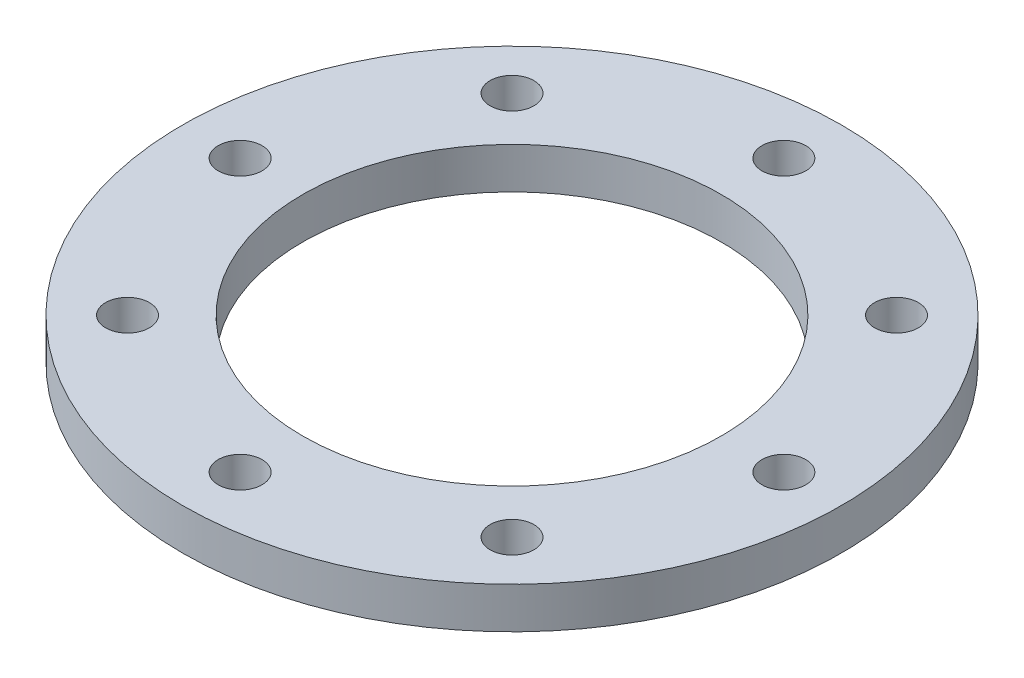
ISO-10303-21;
HEADER;
FILE_DESCRIPTION(('STEP AP214'),'2;1');
FILE_NAME('part.step','',(''),(''),'','','');
FILE_SCHEMA(('AUTOMOTIVE_DESIGN { 1 0 10303 214 1 1 1 1 }'));
ENDSEC;
DATA;
#1=APPLICATION_CONTEXT('core data for automotive mechanical design processes');
#2=APPLICATION_PROTOCOL_DEFINITION('international standard','automotive_design',2000,#1);
#3=PRODUCT_CONTEXT('',#1,'mechanical');
#4=PRODUCT('Part','Part','',(#3));
#5=PRODUCT_RELATED_PRODUCT_CATEGORY('part','',(#4));
#6=PRODUCT_DEFINITION_FORMATION('','',#4);
#7=PRODUCT_DEFINITION_CONTEXT('part definition',#1,'design');
#8=PRODUCT_DEFINITION('design','',#6,#7);
#9=PRODUCT_DEFINITION_SHAPE('','',#8);
#10=(LENGTH_UNIT() NAMED_UNIT(*) SI_UNIT(.MILLI.,.METRE.));
#11=(NAMED_UNIT(*) PLANE_ANGLE_UNIT() SI_UNIT($,.RADIAN.));
#12=(NAMED_UNIT(*) SI_UNIT($,.STERADIAN.) SOLID_ANGLE_UNIT());
#13=UNCERTAINTY_MEASURE_WITH_UNIT(LENGTH_MEASURE(1.E-05),#10,'distance_accuracy_value','');
#14=(GEOMETRIC_REPRESENTATION_CONTEXT(3) GLOBAL_UNCERTAINTY_ASSIGNED_CONTEXT((#13)) GLOBAL_UNIT_ASSIGNED_CONTEXT((#10,
#11,#12)) REPRESENTATION_CONTEXT('',''));
#15=CARTESIAN_POINT('',(0.,0.,0.));
#16=DIRECTION('',(0.,0.,1.));
#17=DIRECTION('',(1.,0.,0.));
#18=AXIS2_PLACEMENT_3D('',#15,#16,#17);
#19=CARTESIAN_POINT('',(0.,6.35,0.));
#20=DIRECTION('',(0.,1.,0.));
#21=DIRECTION('',(0.,0.,1.));
#22=AXIS2_PLACEMENT_3D('',#19,#20,#21);
#23=PLANE('',#22);
#24=CARTESIAN_POINT('',(-29.6348451995278,6.35,-29.6348451995286));
#25=DIRECTION('',(0.,1.,0.));
#26=DIRECTION('',(0.,0.,1.));
#27=AXIS2_PLACEMENT_3D('',#24,#25,#26);
#28=CIRCLE('',#27,3.37819999999999);
#29=CARTESIAN_POINT('',(-29.6348451995278,6.35,-26.2566451995286));
#30=VERTEX_POINT('',#29);
#31=EDGE_CURVE('E94',#30,#30,#28,.T.);
#32=ORIENTED_EDGE('',*,*,#31,.F.);
#33=EDGE_LOOP('',(#32));
#34=FACE_BOUND('',#33,.T.);
#35=CARTESIAN_POINT('',(-41.91,6.35,-4.38983948732747E-13));
#36=DIRECTION('',(0.,1.,0.));
#37=DIRECTION('',(0.,0.,1.));
#38=AXIS2_PLACEMENT_3D('',#35,#36,#37);
#39=CIRCLE('',#38,3.37819999999999);
#40=CARTESIAN_POINT('',(-41.91,6.35,3.37819999999955));
#41=VERTEX_POINT('',#40);
#42=EDGE_CURVE('E88',#41,#41,#39,.T.);
#43=ORIENTED_EDGE('',*,*,#42,.F.);
#44=EDGE_LOOP('',(#43));
#45=FACE_BOUND('',#44,.T.);
#46=CARTESIAN_POINT('',(-29.6348451995285,6.35,29.6348451995279));
#47=DIRECTION('',(0.,1.,0.));
#48=DIRECTION('',(0.,0.,1.));
#49=AXIS2_PLACEMENT_3D('',#46,#47,#48);
#50=CIRCLE('',#49,3.37819999999999);
#51=CARTESIAN_POINT('',(-29.6348451995285,6.35,33.0130451995279));
#52=VERTEX_POINT('',#51);
#53=EDGE_CURVE('E82',#52,#52,#50,.T.);
#54=ORIENTED_EDGE('',*,*,#53,.F.);
#55=EDGE_LOOP('',(#54));
#56=FACE_BOUND('',#55,.T.);
#57=CARTESIAN_POINT('',(0.,6.35,41.91));
#58=DIRECTION('',(0.,1.,0.));
#59=DIRECTION('',(0.,0.,1.));
#60=AXIS2_PLACEMENT_3D('',#57,#58,#59);
#61=CIRCLE('',#60,3.37819999999999);
#62=CARTESIAN_POINT('',(0.,6.35,45.2882));
#63=VERTEX_POINT('',#62);
#64=EDGE_CURVE('E76',#63,#63,#61,.T.);
#65=ORIENTED_EDGE('',*,*,#64,.F.);
#66=EDGE_LOOP('',(#65));
#67=FACE_BOUND('',#66,.T.);
#68=CARTESIAN_POINT('',(29.634845199528,6.35,29.6348451995284));
#69=DIRECTION('',(0.,1.,0.));
#70=DIRECTION('',(0.,0.,1.));
#71=AXIS2_PLACEMENT_3D('',#68,#69,#70);
#72=CIRCLE('',#71,3.37819999999999);
#73=CARTESIAN_POINT('',(29.634845199528,6.35,33.0130451995283));
#74=VERTEX_POINT('',#73);
#75=EDGE_CURVE('E70',#74,#74,#72,.T.);
#76=ORIENTED_EDGE('',*,*,#75,.F.);
#77=EDGE_LOOP('',(#76));
#78=FACE_BOUND('',#77,.T.);
#79=CARTESIAN_POINT('',(41.91,6.35,1.46327982910916E-13));
#80=DIRECTION('',(0.,1.,0.));
#81=DIRECTION('',(0.,0.,1.));
#82=AXIS2_PLACEMENT_3D('',#79,#80,#81);
#83=CIRCLE('',#82,3.37819999999999);
#84=CARTESIAN_POINT('',(41.91,6.35,3.37820000000014));
#85=VERTEX_POINT('',#84);
#86=EDGE_CURVE('E64',#85,#85,#83,.T.);
#87=ORIENTED_EDGE('',*,*,#86,.F.);
#88=EDGE_LOOP('',(#87));
#89=FACE_BOUND('',#88,.T.);
#90=CARTESIAN_POINT('',(29.6348451995283,6.35,-29.6348451995282));
#91=DIRECTION('',(0.,1.,0.));
#92=DIRECTION('',(0.,0.,1.));
#93=AXIS2_PLACEMENT_3D('',#90,#91,#92);
#94=CIRCLE('',#93,3.37819999999999);
#95=CARTESIAN_POINT('',(29.6348451995283,6.35,-26.2566451995282));
#96=VERTEX_POINT('',#95);
#97=EDGE_CURVE('E58',#96,#96,#94,.T.);
#98=ORIENTED_EDGE('',*,*,#97,.F.);
#99=EDGE_LOOP('',(#98));
#100=FACE_BOUND('',#99,.T.);
#101=CARTESIAN_POINT('',(0.,6.35,-41.91));
#102=DIRECTION('',(0.,1.,0.));
#103=DIRECTION('',(0.,0.,1.));
#104=AXIS2_PLACEMENT_3D('',#101,#102,#103);
#105=CIRCLE('',#104,3.37819999999999);
#106=CARTESIAN_POINT('',(0.,6.35,-38.5318));
#107=VERTEX_POINT('',#106);
#108=EDGE_CURVE('E52',#107,#107,#105,.T.);
#109=ORIENTED_EDGE('',*,*,#108,.F.);
#110=EDGE_LOOP('',(#109));
#111=FACE_BOUND('',#110,.T.);
#112=CARTESIAN_POINT('',(0.,6.35,0.));
#113=DIRECTION('',(0.,1.,0.));
#114=DIRECTION('',(0.,0.,1.));
#115=AXIS2_PLACEMENT_3D('',#112,#113,#114);
#116=CIRCLE('',#115,50.8);
#117=CARTESIAN_POINT('',(0.,6.35,50.8));
#118=VERTEX_POINT('',#117);
#119=EDGE_CURVE('E10',#118,#118,#116,.T.);
#120=ORIENTED_EDGE('',*,*,#119,.T.);
#121=EDGE_LOOP('',(#120));
#122=FACE_BOUND('',#121,.T.);
#123=CARTESIAN_POINT('',(0.,6.35,0.));
#124=DIRECTION('',(0.,1.,0.));
#125=DIRECTION('',(0.,0.,1.));
#126=AXIS2_PLACEMENT_3D('',#123,#124,#125);
#127=CIRCLE('',#126,32.258);
#128=CARTESIAN_POINT('',(0.,6.35,32.258));
#129=VERTEX_POINT('',#128);
#130=EDGE_CURVE('E42',#129,#129,#127,.T.);
#131=ORIENTED_EDGE('',*,*,#130,.F.);
#132=EDGE_LOOP('',(#131));
#133=FACE_BOUND('',#132,.T.);
#134=ADVANCED_FACE('F31',(#34,#45,#56,#67,#78,#89,#100,#111,#122,#133),#23,.T.);
#135=CARTESIAN_POINT('',(0.,0.,0.));
#136=DIRECTION('',(0.,1.,0.));
#137=DIRECTION('',(0.,0.,1.));
#138=AXIS2_PLACEMENT_3D('',#135,#136,#137);
#139=PLANE('',#138);
#140=CARTESIAN_POINT('',(-29.6348451995278,0.,-29.6348451995286));
#141=DIRECTION('',(0.,1.,0.));
#142=DIRECTION('',(0.,0.,1.));
#143=AXIS2_PLACEMENT_3D('',#140,#141,#142);
#144=CIRCLE('',#143,3.3782);
#145=CARTESIAN_POINT('',(-29.6348451995278,0.,-26.2566451995286));
#146=VERTEX_POINT('',#145);
#147=EDGE_CURVE('E91',#146,#146,#144,.T.);
#148=ORIENTED_EDGE('',*,*,#147,.T.);
#149=EDGE_LOOP('',(#148));
#150=FACE_BOUND('',#149,.T.);
#151=CARTESIAN_POINT('',(-41.91,0.,-4.38983948732747E-13));
#152=DIRECTION('',(0.,1.,0.));
#153=DIRECTION('',(0.,0.,1.));
#154=AXIS2_PLACEMENT_3D('',#151,#152,#153);
#155=CIRCLE('',#154,3.3782);
#156=CARTESIAN_POINT('',(-41.91,0.,3.37819999999956));
#157=VERTEX_POINT('',#156);
#158=EDGE_CURVE('E85',#157,#157,#155,.T.);
#159=ORIENTED_EDGE('',*,*,#158,.T.);
#160=EDGE_LOOP('',(#159));
#161=FACE_BOUND('',#160,.T.);
#162=CARTESIAN_POINT('',(-29.6348451995285,0.,29.6348451995279));
#163=DIRECTION('',(0.,1.,0.));
#164=DIRECTION('',(0.,0.,1.));
#165=AXIS2_PLACEMENT_3D('',#162,#163,#164);
#166=CIRCLE('',#165,3.3782);
#167=CARTESIAN_POINT('',(-29.6348451995285,0.,33.0130451995279));
#168=VERTEX_POINT('',#167);
#169=EDGE_CURVE('E79',#168,#168,#166,.T.);
#170=ORIENTED_EDGE('',*,*,#169,.T.);
#171=EDGE_LOOP('',(#170));
#172=FACE_BOUND('',#171,.T.);
#173=CARTESIAN_POINT('',(0.,0.,41.91));
#174=DIRECTION('',(0.,1.,0.));
#175=DIRECTION('',(0.,0.,1.));
#176=AXIS2_PLACEMENT_3D('',#173,#174,#175);
#177=CIRCLE('',#176,3.3782);
#178=CARTESIAN_POINT('',(0.,0.,45.2882));
#179=VERTEX_POINT('',#178);
#180=EDGE_CURVE('E73',#179,#179,#177,.T.);
#181=ORIENTED_EDGE('',*,*,#180,.T.);
#182=EDGE_LOOP('',(#181));
#183=FACE_BOUND('',#182,.T.);
#184=CARTESIAN_POINT('',(29.634845199528,0.,29.6348451995284));
#185=DIRECTION('',(0.,1.,0.));
#186=DIRECTION('',(0.,0.,1.));
#187=AXIS2_PLACEMENT_3D('',#184,#185,#186);
#188=CIRCLE('',#187,3.3782);
#189=CARTESIAN_POINT('',(29.634845199528,0.,33.0130451995284));
#190=VERTEX_POINT('',#189);
#191=EDGE_CURVE('E67',#190,#190,#188,.T.);
#192=ORIENTED_EDGE('',*,*,#191,.T.);
#193=EDGE_LOOP('',(#192));
#194=FACE_BOUND('',#193,.T.);
#195=CARTESIAN_POINT('',(41.91,0.,1.46327982910916E-13));
#196=DIRECTION('',(0.,1.,0.));
#197=DIRECTION('',(0.,0.,1.));
#198=AXIS2_PLACEMENT_3D('',#195,#196,#197);
#199=CIRCLE('',#198,3.3782);
#200=CARTESIAN_POINT('',(41.91,0.,3.37820000000014));
#201=VERTEX_POINT('',#200);
#202=EDGE_CURVE('E61',#201,#201,#199,.T.);
#203=ORIENTED_EDGE('',*,*,#202,.T.);
#204=EDGE_LOOP('',(#203));
#205=FACE_BOUND('',#204,.T.);
#206=CARTESIAN_POINT('',(29.6348451995283,0.,-29.6348451995282));
#207=DIRECTION('',(0.,1.,0.));
#208=DIRECTION('',(0.,0.,1.));
#209=AXIS2_PLACEMENT_3D('',#206,#207,#208);
#210=CIRCLE('',#209,3.3782);
#211=CARTESIAN_POINT('',(29.6348451995283,0.,-26.2566451995282));
#212=VERTEX_POINT('',#211);
#213=EDGE_CURVE('E55',#212,#212,#210,.T.);
#214=ORIENTED_EDGE('',*,*,#213,.T.);
#215=EDGE_LOOP('',(#214));
#216=FACE_BOUND('',#215,.T.);
#217=CARTESIAN_POINT('',(0.,0.,-41.91));
#218=DIRECTION('',(0.,1.,0.));
#219=DIRECTION('',(0.,0.,1.));
#220=AXIS2_PLACEMENT_3D('',#217,#218,#219);
#221=CIRCLE('',#220,3.3782);
#222=CARTESIAN_POINT('',(0.,0.,-38.5318));
#223=VERTEX_POINT('',#222);
#224=EDGE_CURVE('E47',#223,#223,#221,.T.);
#225=ORIENTED_EDGE('',*,*,#224,.T.);
#226=EDGE_LOOP('',(#225));
#227=FACE_BOUND('',#226,.T.);
#228=CARTESIAN_POINT('',(0.,0.,0.));
#229=DIRECTION('',(0.,1.,0.));
#230=DIRECTION('',(0.,0.,1.));
#231=AXIS2_PLACEMENT_3D('',#228,#229,#230);
#232=CIRCLE('',#231,50.8);
#233=CARTESIAN_POINT('',(0.,0.,50.8));
#234=VERTEX_POINT('',#233);
#235=EDGE_CURVE('E35',#234,#234,#232,.T.);
#236=ORIENTED_EDGE('',*,*,#235,.F.);
#237=EDGE_LOOP('',(#236));
#238=FACE_BOUND('',#237,.T.);
#239=CARTESIAN_POINT('',(0.,0.,0.));
#240=DIRECTION('',(0.,1.,0.));
#241=DIRECTION('',(0.,0.,1.));
#242=AXIS2_PLACEMENT_3D('',#239,#240,#241);
#243=CIRCLE('',#242,32.258);
#244=CARTESIAN_POINT('',(0.,0.,32.258));
#245=VERTEX_POINT('',#244);
#246=EDGE_CURVE('E44',#245,#245,#243,.T.);
#247=ORIENTED_EDGE('',*,*,#246,.T.);
#248=EDGE_LOOP('',(#247));
#249=FACE_BOUND('',#248,.T.);
#250=ADVANCED_FACE('F102',(#150,#161,#172,#183,#194,#205,#216,#227,#238,#249),#139,.F.);
#251=CARTESIAN_POINT('',(0.,6.35,0.));
#252=DIRECTION('',(0.,-1.,0.));
#253=DIRECTION('',(0.,0.,-1.));
#254=AXIS2_PLACEMENT_3D('',#251,#252,#253);
#255=CYLINDRICAL_SURFACE('',#254,50.8);
#256=ORIENTED_EDGE('',*,*,#119,.F.);
#257=EDGE_LOOP('',(#256));
#258=FACE_BOUND('',#257,.T.);
#259=ORIENTED_EDGE('',*,*,#235,.T.);
#260=EDGE_LOOP('',(#259));
#261=FACE_BOUND('',#260,.T.);
#262=ADVANCED_FACE('F33',(#258,#261),#255,.T.);
#263=CARTESIAN_POINT('',(0.,6.35,0.));
#264=DIRECTION('',(0.,-1.,0.));
#265=DIRECTION('',(0.,0.,-1.));
#266=AXIS2_PLACEMENT_3D('',#263,#264,#265);
#267=CYLINDRICAL_SURFACE('',#266,32.258);
#268=ORIENTED_EDGE('',*,*,#130,.T.);
#269=EDGE_LOOP('',(#268));
#270=FACE_BOUND('',#269,.T.);
#271=ORIENTED_EDGE('',*,*,#246,.F.);
#272=EDGE_LOOP('',(#271));
#273=FACE_BOUND('',#272,.T.);
#274=ADVANCED_FACE('F120',(#270,#273),#267,.F.);
#275=CARTESIAN_POINT('',(0.,6.35,-41.91));
#276=DIRECTION('',(0.,1.,0.));
#277=DIRECTION('',(0.,0.,1.));
#278=AXIS2_PLACEMENT_3D('',#275,#276,#277);
#279=CYLINDRICAL_SURFACE('',#278,3.37819999999999);
#280=ORIENTED_EDGE('',*,*,#224,.F.);
#281=EDGE_LOOP('',(#280));
#282=FACE_BOUND('',#281,.T.);
#283=ORIENTED_EDGE('',*,*,#108,.T.);
#284=EDGE_LOOP('',(#283));
#285=FACE_BOUND('',#284,.T.);
#286=ADVANCED_FACE('F123',(#282,#285),#279,.F.);
#287=CARTESIAN_POINT('',(29.6348451995283,6.35,-29.6348451995282));
#288=DIRECTION('',(0.,1.,0.));
#289=DIRECTION('',(0.,0.,1.));
#290=AXIS2_PLACEMENT_3D('',#287,#288,#289);
#291=CYLINDRICAL_SURFACE('',#290,3.37819999999999);
#292=ORIENTED_EDGE('',*,*,#213,.F.);
#293=EDGE_LOOP('',(#292));
#294=FACE_BOUND('',#293,.T.);
#295=ORIENTED_EDGE('',*,*,#97,.T.);
#296=EDGE_LOOP('',(#295));
#297=FACE_BOUND('',#296,.T.);
#298=ADVANCED_FACE('F137',(#294,#297),#291,.F.);
#299=CARTESIAN_POINT('',(41.91,6.35,1.46327982910916E-13));
#300=DIRECTION('',(0.,1.,0.));
#301=DIRECTION('',(0.,0.,1.));
#302=AXIS2_PLACEMENT_3D('',#299,#300,#301);
#303=CYLINDRICAL_SURFACE('',#302,3.37819999999999);
#304=ORIENTED_EDGE('',*,*,#202,.F.);
#305=EDGE_LOOP('',(#304));
#306=FACE_BOUND('',#305,.T.);
#307=ORIENTED_EDGE('',*,*,#86,.T.);
#308=EDGE_LOOP('',(#307));
#309=FACE_BOUND('',#308,.T.);
#310=ADVANCED_FACE('F141',(#306,#309),#303,.F.);
#311=CARTESIAN_POINT('',(29.634845199528,6.35,29.6348451995284));
#312=DIRECTION('',(0.,1.,0.));
#313=DIRECTION('',(0.,0.,1.));
#314=AXIS2_PLACEMENT_3D('',#311,#312,#313);
#315=CYLINDRICAL_SURFACE('',#314,3.37819999999999);
#316=ORIENTED_EDGE('',*,*,#191,.F.);
#317=EDGE_LOOP('',(#316));
#318=FACE_BOUND('',#317,.T.);
#319=ORIENTED_EDGE('',*,*,#75,.T.);
#320=EDGE_LOOP('',(#319));
#321=FACE_BOUND('',#320,.T.);
#322=ADVANCED_FACE('F145',(#318,#321),#315,.F.);
#323=CARTESIAN_POINT('',(0.,6.35,41.91));
#324=DIRECTION('',(0.,1.,0.));
#325=DIRECTION('',(0.,0.,1.));
#326=AXIS2_PLACEMENT_3D('',#323,#324,#325);
#327=CYLINDRICAL_SURFACE('',#326,3.37819999999999);
#328=ORIENTED_EDGE('',*,*,#180,.F.);
#329=EDGE_LOOP('',(#328));
#330=FACE_BOUND('',#329,.T.);
#331=ORIENTED_EDGE('',*,*,#64,.T.);
#332=EDGE_LOOP('',(#331));
#333=FACE_BOUND('',#332,.T.);
#334=ADVANCED_FACE('F149',(#330,#333),#327,.F.);
#335=CARTESIAN_POINT('',(-29.6348451995285,6.35,29.6348451995279));
#336=DIRECTION('',(0.,1.,0.));
#337=DIRECTION('',(0.,0.,1.));
#338=AXIS2_PLACEMENT_3D('',#335,#336,#337);
#339=CYLINDRICAL_SURFACE('',#338,3.37819999999999);
#340=ORIENTED_EDGE('',*,*,#169,.F.);
#341=EDGE_LOOP('',(#340));
#342=FACE_BOUND('',#341,.T.);
#343=ORIENTED_EDGE('',*,*,#53,.T.);
#344=EDGE_LOOP('',(#343));
#345=FACE_BOUND('',#344,.T.);
#346=ADVANCED_FACE('F153',(#342,#345),#339,.F.);
#347=CARTESIAN_POINT('',(-41.91,6.35,-4.38983948732747E-13));
#348=DIRECTION('',(0.,1.,0.));
#349=DIRECTION('',(0.,0.,1.));
#350=AXIS2_PLACEMENT_3D('',#347,#348,#349);
#351=CYLINDRICAL_SURFACE('',#350,3.37819999999999);
#352=ORIENTED_EDGE('',*,*,#158,.F.);
#353=EDGE_LOOP('',(#352));
#354=FACE_BOUND('',#353,.T.);
#355=ORIENTED_EDGE('',*,*,#42,.T.);
#356=EDGE_LOOP('',(#355));
#357=FACE_BOUND('',#356,.T.);
#358=ADVANCED_FACE('F157',(#354,#357),#351,.F.);
#359=CARTESIAN_POINT('',(-29.6348451995278,6.35,-29.6348451995286));
#360=DIRECTION('',(0.,1.,0.));
#361=DIRECTION('',(0.,0.,1.));
#362=AXIS2_PLACEMENT_3D('',#359,#360,#361);
#363=CYLINDRICAL_SURFACE('',#362,3.37819999999999);
#364=ORIENTED_EDGE('',*,*,#147,.F.);
#365=EDGE_LOOP('',(#364));
#366=FACE_BOUND('',#365,.T.);
#367=ORIENTED_EDGE('',*,*,#31,.T.);
#368=EDGE_LOOP('',(#367));
#369=FACE_BOUND('',#368,.T.);
#370=ADVANCED_FACE('F98',(#366,#369),#363,.F.);
#371=CLOSED_SHELL('',(#134,#250,#262,#274,#286,#298,#310,#322,#334,#346,#358,#370));
#372=MANIFOLD_SOLID_BREP('B2',#371);
#373=ADVANCED_BREP_SHAPE_REPRESENTATION('',(#18,#372),#14);
#374=SHAPE_DEFINITION_REPRESENTATION(#9,#373);
ENDSEC;
END-ISO-10303-21;
